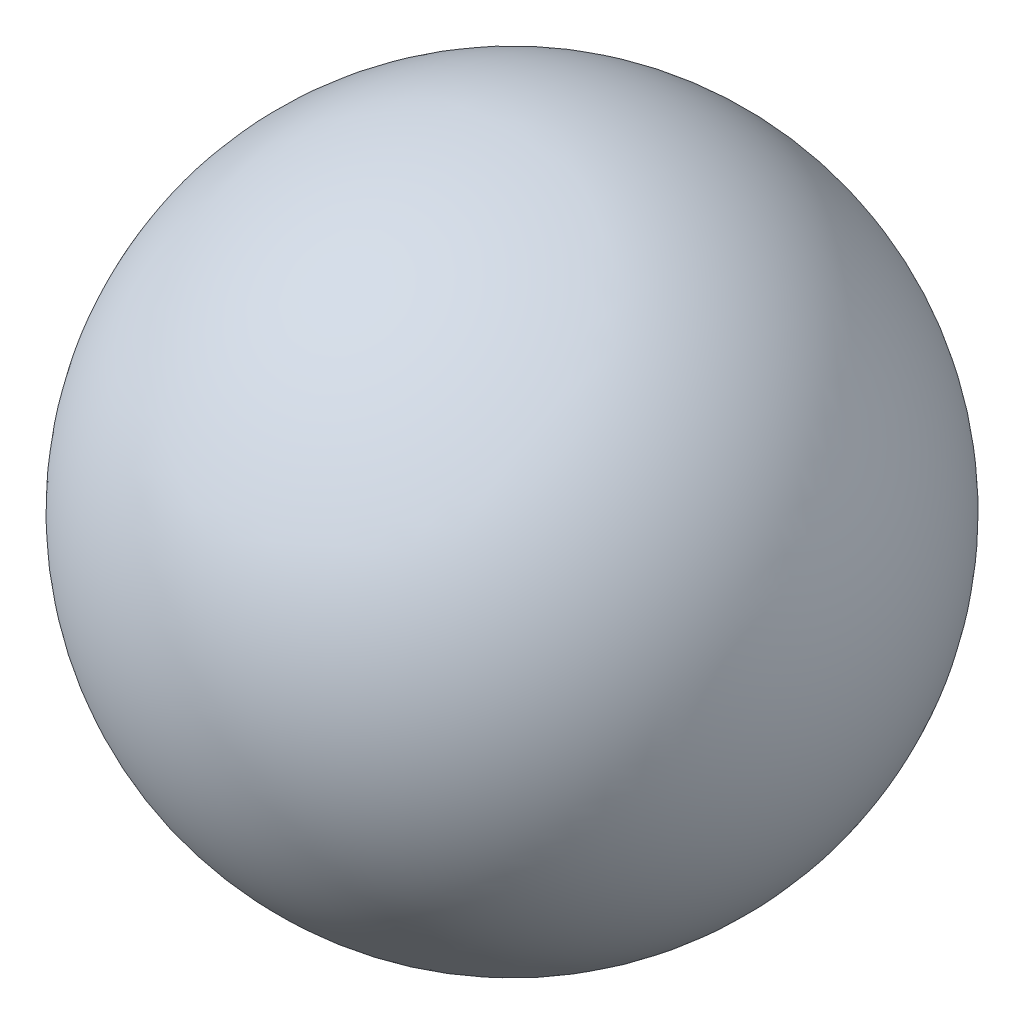
ISO-10303-21;
HEADER;
FILE_DESCRIPTION(('STEP AP214'),'2;1');
FILE_NAME('part.step','',(''),(''),'','','');
FILE_SCHEMA(('AUTOMOTIVE_DESIGN { 1 0 10303 214 1 1 1 1 }'));
ENDSEC;
DATA;
#1=APPLICATION_CONTEXT('core data for automotive mechanical design processes');
#2=APPLICATION_PROTOCOL_DEFINITION('international standard','automotive_design',2000,#1);
#3=PRODUCT_CONTEXT('',#1,'mechanical');
#4=PRODUCT('Part','Part','',(#3));
#5=PRODUCT_RELATED_PRODUCT_CATEGORY('part','',(#4));
#6=PRODUCT_DEFINITION_FORMATION('','',#4);
#7=PRODUCT_DEFINITION_CONTEXT('part definition',#1,'design');
#8=PRODUCT_DEFINITION('design','',#6,#7);
#9=PRODUCT_DEFINITION_SHAPE('','',#8);
#10=(LENGTH_UNIT() NAMED_UNIT(*) SI_UNIT(.MILLI.,.METRE.));
#11=(NAMED_UNIT(*) PLANE_ANGLE_UNIT() SI_UNIT($,.RADIAN.));
#12=(NAMED_UNIT(*) SI_UNIT($,.STERADIAN.) SOLID_ANGLE_UNIT());
#13=UNCERTAINTY_MEASURE_WITH_UNIT(LENGTH_MEASURE(1.E-05),#10,'distance_accuracy_value','');
#14=(GEOMETRIC_REPRESENTATION_CONTEXT(3) GLOBAL_UNCERTAINTY_ASSIGNED_CONTEXT((#13)) GLOBAL_UNIT_ASSIGNED_CONTEXT((#10,
#11,#12)) REPRESENTATION_CONTEXT('',''));
#15=CARTESIAN_POINT('',(0.,0.,0.));
#16=DIRECTION('',(0.,0.,1.));
#17=DIRECTION('',(1.,0.,0.));
#18=AXIS2_PLACEMENT_3D('',#15,#16,#17);
#19=CARTESIAN_POINT('',(0.,0.,0.));
#20=DIRECTION('',(-0.994984953119392,0.100024712276524,0.));
#21=DIRECTION('',(0.100024712276524,0.994984953119392,0.));
#22=AXIS2_PLACEMENT_3D('',#19,#20,#21);
#23=SPHERICAL_SURFACE('',#22,4.);
#24=CARTESIAN_POINT('',(-3.97993981247757,0.400098849106096,0.));
#25=VERTEX_POINT('',#24);
#26=VERTEX_LOOP('',#25);
#27=FACE_BOUND('',#26,.T.);
#28=ADVANCED_FACE('F31',(#27),#23,.T.);
#29=CLOSED_SHELL('',(#28));
#30=MANIFOLD_SOLID_BREP('B2',#29);
#31=ADVANCED_BREP_SHAPE_REPRESENTATION('',(#18,#30),#14);
#32=SHAPE_DEFINITION_REPRESENTATION(#9,#31);
ENDSEC;
END-ISO-10303-21;
